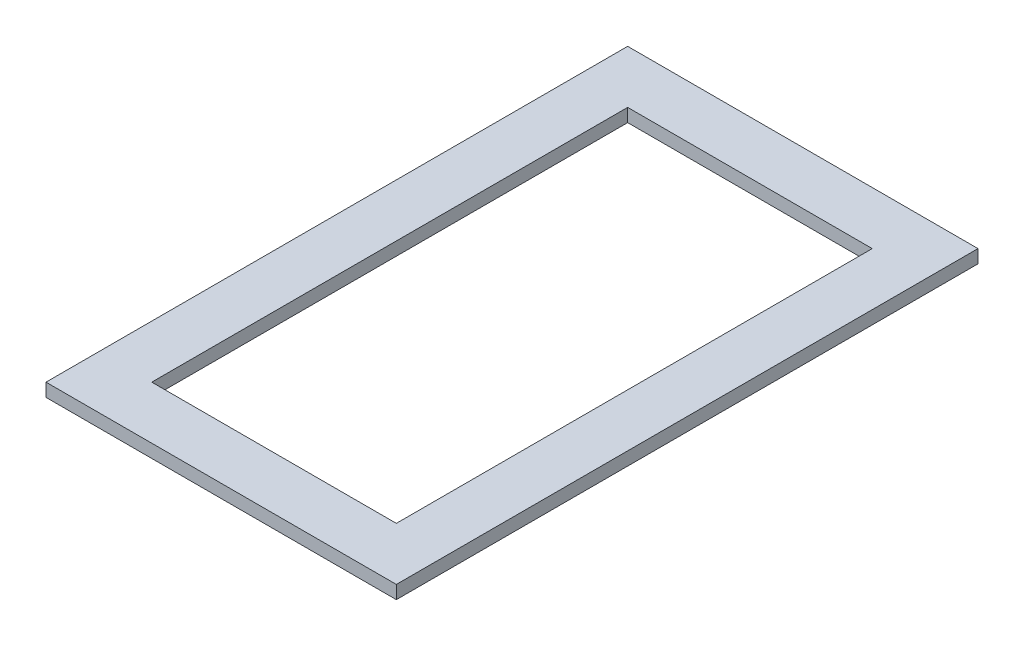
ISO-10303-21;
HEADER;
FILE_DESCRIPTION(('STEP AP214'),'2;1');
FILE_NAME('part.step','',(''),(''),'','','');
FILE_SCHEMA(('AUTOMOTIVE_DESIGN { 1 0 10303 214 1 1 1 1 }'));
ENDSEC;
DATA;
#1=APPLICATION_CONTEXT('core data for automotive mechanical design processes');
#2=APPLICATION_PROTOCOL_DEFINITION('international standard','automotive_design',2000,#1);
#3=PRODUCT_CONTEXT('',#1,'mechanical');
#4=PRODUCT('Part','Part','',(#3));
#5=PRODUCT_RELATED_PRODUCT_CATEGORY('part','',(#4));
#6=PRODUCT_DEFINITION_FORMATION('','',#4);
#7=PRODUCT_DEFINITION_CONTEXT('part definition',#1,'design');
#8=PRODUCT_DEFINITION('design','',#6,#7);
#9=PRODUCT_DEFINITION_SHAPE('','',#8);
#10=(LENGTH_UNIT() NAMED_UNIT(*) SI_UNIT(.MILLI.,.METRE.));
#11=(NAMED_UNIT(*) PLANE_ANGLE_UNIT() SI_UNIT($,.RADIAN.));
#12=(NAMED_UNIT(*) SI_UNIT($,.STERADIAN.) SOLID_ANGLE_UNIT());
#13=UNCERTAINTY_MEASURE_WITH_UNIT(LENGTH_MEASURE(1.E-05),#10,'distance_accuracy_value','');
#14=(GEOMETRIC_REPRESENTATION_CONTEXT(3) GLOBAL_UNCERTAINTY_ASSIGNED_CONTEXT((#13)) GLOBAL_UNIT_ASSIGNED_CONTEXT((#10,
#11,#12)) REPRESENTATION_CONTEXT('',''));
#15=CARTESIAN_POINT('',(0.,0.,0.));
#16=DIRECTION('',(0.,0.,1.));
#17=DIRECTION('',(1.,0.,0.));
#18=AXIS2_PLACEMENT_3D('',#15,#16,#17);
#19=CARTESIAN_POINT('',(-3312.49999999998,-250.,-5500.));
#20=DIRECTION('',(-1.,0.,0.));
#21=DIRECTION('',(0.,0.,1.));
#22=AXIS2_PLACEMENT_3D('',#19,#20,#21);
#23=PLANE('',#22);
#24=DIRECTION('',(0.,0.,1.));
#25=VECTOR('',#24,1.);
#26=CARTESIAN_POINT('',(-3312.49999999998,0.,-5500.));
#27=LINE('',#26,#25);
#28=CARTESIAN_POINT('',(-3312.49999999998,0.,-5500.));
#29=VERTEX_POINT('',#28);
#30=CARTESIAN_POINT('',(-3312.49999999998,0.,5500.));
#31=VERTEX_POINT('',#30);
#32=EDGE_CURVE('E146',#29,#31,#27,.T.);
#33=ORIENTED_EDGE('',*,*,#32,.F.);
#34=DIRECTION('',(0.,1.,0.));
#35=VECTOR('',#34,1.);
#36=CARTESIAN_POINT('',(-3312.49999999998,-250.,-5500.));
#37=LINE('',#36,#35);
#38=CARTESIAN_POINT('',(-3312.49999999998,-250.,-5500.));
#39=VERTEX_POINT('',#38);
#40=EDGE_CURVE('E11',#39,#29,#37,.T.);
#41=ORIENTED_EDGE('',*,*,#40,.F.);
#42=DIRECTION('',(0.,0.,1.));
#43=VECTOR('',#42,1.);
#44=CARTESIAN_POINT('',(-3312.49999999998,-250.,-5500.));
#45=LINE('',#44,#43);
#46=CARTESIAN_POINT('',(-3312.49999999998,-250.,5500.));
#47=VERTEX_POINT('',#46);
#48=EDGE_CURVE('E152',#39,#47,#45,.T.);
#49=ORIENTED_EDGE('',*,*,#48,.T.);
#50=DIRECTION('',(0.,1.,0.));
#51=VECTOR('',#50,1.);
#52=CARTESIAN_POINT('',(-3312.49999999998,-250.,5500.));
#53=LINE('',#52,#51);
#54=EDGE_CURVE('E39',#47,#31,#53,.T.);
#55=ORIENTED_EDGE('',*,*,#54,.T.);
#56=EDGE_LOOP('',(#33,#41,#49,#55));
#57=FACE_BOUND('',#56,.T.);
#58=ADVANCED_FACE('F36',(#57),#23,.T.);
#59=CARTESIAN_POINT('',(-3312.49999999998,-250.,-5500.));
#60=DIRECTION('',(0.,0.,-1.));
#61=DIRECTION('',(-1.,0.,0.));
#62=AXIS2_PLACEMENT_3D('',#59,#60,#61);
#63=PLANE('',#62);
#64=DIRECTION('',(-1.,0.,0.));
#65=VECTOR('',#64,1.);
#66=CARTESIAN_POINT('',(-3312.49999999998,0.,-5500.));
#67=LINE('',#66,#65);
#68=CARTESIAN_POINT('',(3312.5,0.,-5500.));
#69=VERTEX_POINT('',#68);
#70=EDGE_CURVE('E157',#69,#29,#67,.T.);
#71=ORIENTED_EDGE('',*,*,#70,.F.);
#72=DIRECTION('',(0.,1.,0.));
#73=VECTOR('',#72,1.);
#74=CARTESIAN_POINT('',(3312.5,-250.,-5500.));
#75=LINE('',#74,#73);
#76=CARTESIAN_POINT('',(3312.5,-250.,-5500.));
#77=VERTEX_POINT('',#76);
#78=EDGE_CURVE('E45',#77,#69,#75,.T.);
#79=ORIENTED_EDGE('',*,*,#78,.F.);
#80=DIRECTION('',(-1.,0.,0.));
#81=VECTOR('',#80,1.);
#82=CARTESIAN_POINT('',(-3312.49999999998,-250.,-5500.));
#83=LINE('',#82,#81);
#84=EDGE_CURVE('E165',#77,#39,#83,.T.);
#85=ORIENTED_EDGE('',*,*,#84,.T.);
#86=ORIENTED_EDGE('',*,*,#40,.T.);
#87=EDGE_LOOP('',(#71,#79,#85,#86));
#88=FACE_BOUND('',#87,.T.);
#89=ADVANCED_FACE('F201',(#88),#63,.T.);
#90=CARTESIAN_POINT('',(3312.5,-250.,-5500.));
#91=DIRECTION('',(1.,0.,0.));
#92=DIRECTION('',(0.,0.,-1.));
#93=AXIS2_PLACEMENT_3D('',#90,#91,#92);
#94=PLANE('',#93);
#95=DIRECTION('',(0.,0.,-1.));
#96=VECTOR('',#95,1.);
#97=CARTESIAN_POINT('',(3312.5,0.,-5500.));
#98=LINE('',#97,#96);
#99=CARTESIAN_POINT('',(3312.5,0.,5500.));
#100=VERTEX_POINT('',#99);
#101=EDGE_CURVE('E176',#100,#69,#98,.T.);
#102=ORIENTED_EDGE('',*,*,#101,.F.);
#103=DIRECTION('',(0.,1.,0.));
#104=VECTOR('',#103,1.);
#105=CARTESIAN_POINT('',(3312.5,-250.,5500.));
#106=LINE('',#105,#104);
#107=CARTESIAN_POINT('',(3312.5,-250.,5500.));
#108=VERTEX_POINT('',#107);
#109=EDGE_CURVE('E184',#108,#100,#106,.T.);
#110=ORIENTED_EDGE('',*,*,#109,.F.);
#111=DIRECTION('',(0.,0.,-1.));
#112=VECTOR('',#111,1.);
#113=CARTESIAN_POINT('',(3312.5,-250.,-5500.));
#114=LINE('',#113,#112);
#115=EDGE_CURVE('E161',#108,#77,#114,.T.);
#116=ORIENTED_EDGE('',*,*,#115,.T.);
#117=ORIENTED_EDGE('',*,*,#78,.T.);
#118=EDGE_LOOP('',(#102,#110,#116,#117));
#119=FACE_BOUND('',#118,.T.);
#120=ADVANCED_FACE('F205',(#119),#94,.T.);
#121=CARTESIAN_POINT('',(-3312.49999999998,-250.,5500.));
#122=DIRECTION('',(0.,0.,1.));
#123=DIRECTION('',(1.,0.,0.));
#124=AXIS2_PLACEMENT_3D('',#121,#122,#123);
#125=PLANE('',#124);
#126=DIRECTION('',(1.,0.,0.));
#127=VECTOR('',#126,1.);
#128=CARTESIAN_POINT('',(-3312.49999999998,0.,5500.));
#129=LINE('',#128,#127);
#130=EDGE_CURVE('E172',#31,#100,#129,.T.);
#131=ORIENTED_EDGE('',*,*,#130,.F.);
#132=ORIENTED_EDGE('',*,*,#54,.F.);
#133=DIRECTION('',(1.,0.,0.));
#134=VECTOR('',#133,1.);
#135=CARTESIAN_POINT('',(-3312.49999999998,-250.,5500.));
#136=LINE('',#135,#134);
#137=EDGE_CURVE('E156',#47,#108,#136,.T.);
#138=ORIENTED_EDGE('',*,*,#137,.T.);
#139=ORIENTED_EDGE('',*,*,#109,.T.);
#140=EDGE_LOOP('',(#131,#132,#138,#139));
#141=FACE_BOUND('',#140,.T.);
#142=ADVANCED_FACE('F196',(#141),#125,.T.);
#143=CARTESIAN_POINT('',(0.,-250.,0.));
#144=DIRECTION('',(0.,1.,0.));
#145=DIRECTION('',(0.,0.,1.));
#146=AXIS2_PLACEMENT_3D('',#143,#144,#145);
#147=PLANE('',#146);
#148=DIRECTION('',(-1.,0.,0.));
#149=VECTOR('',#148,1.);
#150=CARTESIAN_POINT('',(-2312.49999999998,-250.,-4500.));
#151=LINE('',#150,#149);
#152=CARTESIAN_POINT('',(2312.5,-250.,-4500.));
#153=VERTEX_POINT('',#152);
#154=CARTESIAN_POINT('',(-2312.49999999998,-250.,-4500.));
#155=VERTEX_POINT('',#154);
#156=EDGE_CURVE('E111',#153,#155,#151,.T.);
#157=ORIENTED_EDGE('',*,*,#156,.T.);
#158=DIRECTION('',(0.,0.,1.));
#159=VECTOR('',#158,1.);
#160=CARTESIAN_POINT('',(-2312.49999999998,-250.,-4500.));
#161=LINE('',#160,#159);
#162=CARTESIAN_POINT('',(-2312.49999999998,-250.,4500.));
#163=VERTEX_POINT('',#162);
#164=EDGE_CURVE('E104',#155,#163,#161,.T.);
#165=ORIENTED_EDGE('',*,*,#164,.T.);
#166=DIRECTION('',(1.,0.,0.));
#167=VECTOR('',#166,1.);
#168=CARTESIAN_POINT('',(-2312.49999999998,-250.,4500.));
#169=LINE('',#168,#167);
#170=CARTESIAN_POINT('',(2312.5,-250.,4500.));
#171=VERTEX_POINT('',#170);
#172=EDGE_CURVE('E114',#163,#171,#169,.T.);
#173=ORIENTED_EDGE('',*,*,#172,.T.);
#174=DIRECTION('',(0.,0.,-1.));
#175=VECTOR('',#174,1.);
#176=CARTESIAN_POINT('',(2312.5,-250.,-4500.));
#177=LINE('',#176,#175);
#178=EDGE_CURVE('E53',#171,#153,#177,.T.);
#179=ORIENTED_EDGE('',*,*,#178,.T.);
#180=EDGE_LOOP('',(#157,#165,#173,#179));
#181=FACE_BOUND('',#180,.T.);
#182=ORIENTED_EDGE('',*,*,#48,.F.);
#183=ORIENTED_EDGE('',*,*,#84,.F.);
#184=ORIENTED_EDGE('',*,*,#115,.F.);
#185=ORIENTED_EDGE('',*,*,#137,.F.);
#186=EDGE_LOOP('',(#182,#183,#184,#185));
#187=FACE_BOUND('',#186,.T.);
#188=ADVANCED_FACE('F119',(#181,#187),#147,.F.);
#189=CARTESIAN_POINT('',(0.,0.,0.));
#190=DIRECTION('',(0.,1.,0.));
#191=DIRECTION('',(0.,0.,1.));
#192=AXIS2_PLACEMENT_3D('',#189,#190,#191);
#193=PLANE('',#192);
#194=DIRECTION('',(0.,0.,1.));
#195=VECTOR('',#194,1.);
#196=CARTESIAN_POINT('',(-2312.49999999998,0.,-4500.));
#197=LINE('',#196,#195);
#198=CARTESIAN_POINT('',(-2312.49999999998,0.,-4500.));
#199=VERTEX_POINT('',#198);
#200=CARTESIAN_POINT('',(-2312.49999999998,0.,4500.));
#201=VERTEX_POINT('',#200);
#202=EDGE_CURVE('E61',#199,#201,#197,.T.);
#203=ORIENTED_EDGE('',*,*,#202,.F.);
#204=DIRECTION('',(-1.,0.,0.));
#205=VECTOR('',#204,1.);
#206=CARTESIAN_POINT('',(-2312.49999999998,0.,-4500.));
#207=LINE('',#206,#205);
#208=CARTESIAN_POINT('',(2312.5,0.,-4500.));
#209=VERTEX_POINT('',#208);
#210=EDGE_CURVE('E123',#209,#199,#207,.T.);
#211=ORIENTED_EDGE('',*,*,#210,.F.);
#212=DIRECTION('',(0.,0.,-1.));
#213=VECTOR('',#212,1.);
#214=CARTESIAN_POINT('',(2312.5,0.,-4500.));
#215=LINE('',#214,#213);
#216=CARTESIAN_POINT('',(2312.5,0.,4500.));
#217=VERTEX_POINT('',#216);
#218=EDGE_CURVE('E128',#217,#209,#215,.T.);
#219=ORIENTED_EDGE('',*,*,#218,.F.);
#220=DIRECTION('',(1.,0.,0.));
#221=VECTOR('',#220,1.);
#222=CARTESIAN_POINT('',(-2312.49999999998,0.,4500.));
#223=LINE('',#222,#221);
#224=EDGE_CURVE('E137',#201,#217,#223,.T.);
#225=ORIENTED_EDGE('',*,*,#224,.F.);
#226=EDGE_LOOP('',(#203,#211,#219,#225));
#227=FACE_BOUND('',#226,.T.);
#228=ORIENTED_EDGE('',*,*,#32,.T.);
#229=ORIENTED_EDGE('',*,*,#130,.T.);
#230=ORIENTED_EDGE('',*,*,#101,.T.);
#231=ORIENTED_EDGE('',*,*,#70,.T.);
#232=EDGE_LOOP('',(#228,#229,#230,#231));
#233=FACE_BOUND('',#232,.T.);
#234=ADVANCED_FACE('F198',(#227,#233),#193,.T.);
#235=CARTESIAN_POINT('',(-2312.49999999998,-250.,-4500.));
#236=DIRECTION('',(-1.,0.,0.));
#237=DIRECTION('',(0.,0.,1.));
#238=AXIS2_PLACEMENT_3D('',#235,#236,#237);
#239=PLANE('',#238);
#240=ORIENTED_EDGE('',*,*,#202,.T.);
#241=DIRECTION('',(0.,1.,0.));
#242=VECTOR('',#241,1.);
#243=CARTESIAN_POINT('',(-2312.49999999998,-250.,4500.));
#244=LINE('',#243,#242);
#245=EDGE_CURVE('E100',#163,#201,#244,.T.);
#246=ORIENTED_EDGE('',*,*,#245,.F.);
#247=ORIENTED_EDGE('',*,*,#164,.F.);
#248=DIRECTION('',(0.,1.,0.));
#249=VECTOR('',#248,1.);
#250=CARTESIAN_POINT('',(-2312.49999999998,-250.,-4500.));
#251=LINE('',#250,#249);
#252=EDGE_CURVE('E143',#155,#199,#251,.T.);
#253=ORIENTED_EDGE('',*,*,#252,.T.);
#254=EDGE_LOOP('',(#240,#246,#247,#253));
#255=FACE_BOUND('',#254,.T.);
#256=ADVANCED_FACE('F102',(#255),#239,.F.);
#257=CARTESIAN_POINT('',(-2312.49999999998,-250.,-4500.));
#258=DIRECTION('',(0.,0.,-1.));
#259=DIRECTION('',(-1.,0.,0.));
#260=AXIS2_PLACEMENT_3D('',#257,#258,#259);
#261=PLANE('',#260);
#262=ORIENTED_EDGE('',*,*,#210,.T.);
#263=ORIENTED_EDGE('',*,*,#252,.F.);
#264=ORIENTED_EDGE('',*,*,#156,.F.);
#265=DIRECTION('',(0.,1.,0.));
#266=VECTOR('',#265,1.);
#267=CARTESIAN_POINT('',(2312.5,-250.,-4500.));
#268=LINE('',#267,#266);
#269=EDGE_CURVE('E147',#153,#209,#268,.T.);
#270=ORIENTED_EDGE('',*,*,#269,.T.);
#271=EDGE_LOOP('',(#262,#263,#264,#270));
#272=FACE_BOUND('',#271,.T.);
#273=ADVANCED_FACE('F256',(#272),#261,.F.);
#274=CARTESIAN_POINT('',(2312.5,-250.,-4500.));
#275=DIRECTION('',(1.,0.,0.));
#276=DIRECTION('',(0.,0.,-1.));
#277=AXIS2_PLACEMENT_3D('',#274,#275,#276);
#278=PLANE('',#277);
#279=ORIENTED_EDGE('',*,*,#218,.T.);
#280=ORIENTED_EDGE('',*,*,#269,.F.);
#281=ORIENTED_EDGE('',*,*,#178,.F.);
#282=DIRECTION('',(0.,1.,0.));
#283=VECTOR('',#282,1.);
#284=CARTESIAN_POINT('',(2312.5,-250.,4500.));
#285=LINE('',#284,#283);
#286=EDGE_CURVE('E110',#171,#217,#285,.T.);
#287=ORIENTED_EDGE('',*,*,#286,.T.);
#288=EDGE_LOOP('',(#279,#280,#281,#287));
#289=FACE_BOUND('',#288,.T.);
#290=ADVANCED_FACE('F265',(#289),#278,.F.);
#291=CARTESIAN_POINT('',(-2312.49999999998,-250.,4500.));
#292=DIRECTION('',(0.,0.,1.));
#293=DIRECTION('',(1.,0.,0.));
#294=AXIS2_PLACEMENT_3D('',#291,#292,#293);
#295=PLANE('',#294);
#296=ORIENTED_EDGE('',*,*,#224,.T.);
#297=ORIENTED_EDGE('',*,*,#286,.F.);
#298=ORIENTED_EDGE('',*,*,#172,.F.);
#299=ORIENTED_EDGE('',*,*,#245,.T.);
#300=EDGE_LOOP('',(#296,#297,#298,#299));
#301=FACE_BOUND('',#300,.T.);
#302=ADVANCED_FACE('F115',(#301),#295,.F.);
#303=CLOSED_SHELL('',(#58,#89,#120,#142,#188,#234,#256,#273,#290,#302));
#304=MANIFOLD_SOLID_BREP('B2',#303);
#305=ADVANCED_BREP_SHAPE_REPRESENTATION('',(#18,#304),#14);
#306=SHAPE_DEFINITION_REPRESENTATION(#9,#305);
ENDSEC;
END-ISO-10303-21;
